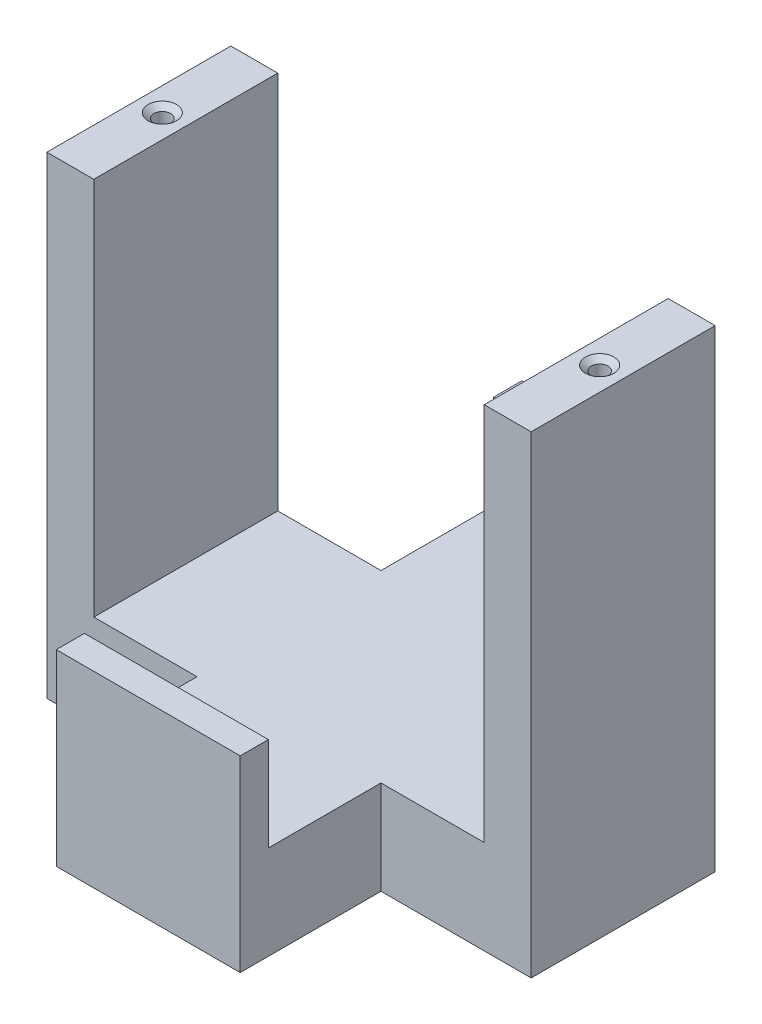
ISO-10303-21;
HEADER;
FILE_DESCRIPTION(('STEP AP214'),'2;1');
FILE_NAME('part.step','',(''),(''),'','','');
FILE_SCHEMA(('AUTOMOTIVE_DESIGN { 1 0 10303 214 1 1 1 1 }'));
ENDSEC;
DATA;
#1=APPLICATION_CONTEXT('core data for automotive mechanical design processes');
#2=APPLICATION_PROTOCOL_DEFINITION('international standard','automotive_design',2000,#1);
#3=PRODUCT_CONTEXT('',#1,'mechanical');
#4=PRODUCT('Part','Part','',(#3));
#5=PRODUCT_RELATED_PRODUCT_CATEGORY('part','',(#4));
#6=PRODUCT_DEFINITION_FORMATION('','',#4);
#7=PRODUCT_DEFINITION_CONTEXT('part definition',#1,'design');
#8=PRODUCT_DEFINITION('design','',#6,#7);
#9=PRODUCT_DEFINITION_SHAPE('','',#8);
#10=(LENGTH_UNIT() NAMED_UNIT(*) SI_UNIT(.MILLI.,.METRE.));
#11=(NAMED_UNIT(*) PLANE_ANGLE_UNIT() SI_UNIT($,.RADIAN.));
#12=(NAMED_UNIT(*) SI_UNIT($,.STERADIAN.) SOLID_ANGLE_UNIT());
#13=UNCERTAINTY_MEASURE_WITH_UNIT(LENGTH_MEASURE(1.E-05),#10,'distance_accuracy_value','');
#14=(GEOMETRIC_REPRESENTATION_CONTEXT(3) GLOBAL_UNCERTAINTY_ASSIGNED_CONTEXT((#13)) GLOBAL_UNIT_ASSIGNED_CONTEXT((#10,
#11,#12)) REPRESENTATION_CONTEXT('',''));
#15=CARTESIAN_POINT('',(0.,0.,0.));
#16=DIRECTION('',(0.,0.,1.));
#17=DIRECTION('',(1.,0.,0.));
#18=AXIS2_PLACEMENT_3D('',#15,#16,#17);
#19=CARTESIAN_POINT('',(0.,50.4,0.));
#20=DIRECTION('',(0.,-1.,0.));
#21=DIRECTION('',(0.,0.,-1.));
#22=AXIS2_PLACEMENT_3D('',#19,#20,#21);
#23=PLANE('',#22);
#24=DIRECTION('',(-1.,0.,0.));
#25=VECTOR('',#24,1.);
#26=CARTESIAN_POINT('',(20.8,50.4,-9.8));
#27=LINE('',#26,#25);
#28=CARTESIAN_POINT('',(25.8,50.4,-9.80000000000001));
#29=VERTEX_POINT('',#28);
#30=CARTESIAN_POINT('',(20.8,50.4,-9.8));
#31=VERTEX_POINT('',#30);
#32=EDGE_CURVE('E201',#29,#31,#27,.T.);
#33=ORIENTED_EDGE('',*,*,#32,.T.);
#34=DIRECTION('',(0.,0.,1.));
#35=VECTOR('',#34,1.);
#36=CARTESIAN_POINT('',(20.8,50.4,-9.8));
#37=LINE('',#36,#35);
#38=CARTESIAN_POINT('',(20.8,50.4,9.8));
#39=VERTEX_POINT('',#38);
#40=EDGE_CURVE('E220',#31,#39,#37,.T.);
#41=ORIENTED_EDGE('',*,*,#40,.T.);
#42=DIRECTION('',(1.,0.,0.));
#43=VECTOR('',#42,1.);
#44=CARTESIAN_POINT('',(20.8,50.4,9.8));
#45=LINE('',#44,#43);
#46=CARTESIAN_POINT('',(25.8,50.4,9.8));
#47=VERTEX_POINT('',#46);
#48=EDGE_CURVE('E223',#39,#47,#45,.T.);
#49=ORIENTED_EDGE('',*,*,#48,.T.);
#50=DIRECTION('',(0.,0.,-1.));
#51=VECTOR('',#50,1.);
#52=CARTESIAN_POINT('',(25.8,50.4,-9.80000000000001));
#53=LINE('',#52,#51);
#54=EDGE_CURVE('E226',#47,#29,#53,.T.);
#55=ORIENTED_EDGE('',*,*,#54,.T.);
#56=EDGE_LOOP('',(#33,#41,#49,#55));
#57=FACE_BOUND('',#56,.T.);
#58=CARTESIAN_POINT('',(23.3,50.4,0.));
#59=DIRECTION('',(0.,1.,0.));
#60=DIRECTION('',(0.,0.,1.));
#61=AXIS2_PLACEMENT_3D('',#58,#59,#60);
#62=CIRCLE('',#61,1.5113);
#63=CARTESIAN_POINT('',(23.3,50.4,1.51130000000001));
#64=VERTEX_POINT('',#63);
#65=EDGE_CURVE('E521',#64,#64,#62,.T.);
#66=ORIENTED_EDGE('',*,*,#65,.F.);
#67=EDGE_LOOP('',(#66));
#68=FACE_BOUND('',#67,.T.);
#69=ADVANCED_FACE('F39',(#57,#68),#23,.F.);
#70=CARTESIAN_POINT('',(9.8,10.,-9.8));
#71=DIRECTION('',(0.,0.,1.));
#72=DIRECTION('',(1.,0.,0.));
#73=AXIS2_PLACEMENT_3D('',#70,#71,#72);
#74=PLANE('',#73);
#75=DIRECTION('',(-1.,0.,0.));
#76=VECTOR('',#75,1.);
#77=CARTESIAN_POINT('',(9.8,0.,-9.8));
#78=LINE('',#77,#76);
#79=CARTESIAN_POINT('',(25.8,0.,-9.80000000000001));
#80=VERTEX_POINT('',#79);
#81=CARTESIAN_POINT('',(9.8,0.,-9.8));
#82=VERTEX_POINT('',#81);
#83=EDGE_CURVE('E145',#80,#82,#78,.T.);
#84=ORIENTED_EDGE('',*,*,#83,.T.);
#85=DIRECTION('',(0.,-1.,0.));
#86=VECTOR('',#85,1.);
#87=CARTESIAN_POINT('',(9.8,10.,-9.8));
#88=LINE('',#87,#86);
#89=CARTESIAN_POINT('',(9.8,10.,-9.8));
#90=VERTEX_POINT('',#89);
#91=EDGE_CURVE('E11',#90,#82,#88,.T.);
#92=ORIENTED_EDGE('',*,*,#91,.F.);
#93=DIRECTION('',(-1.,0.,0.));
#94=VECTOR('',#93,1.);
#95=CARTESIAN_POINT('',(9.8,10.,-9.8));
#96=LINE('',#95,#94);
#97=CARTESIAN_POINT('',(20.8,10.,-9.8));
#98=VERTEX_POINT('',#97);
#99=EDGE_CURVE('E164',#98,#90,#96,.T.);
#100=ORIENTED_EDGE('',*,*,#99,.F.);
#101=DIRECTION('',(0.,-1.,0.));
#102=VECTOR('',#101,1.);
#103=CARTESIAN_POINT('',(20.8,50.4,-9.8));
#104=LINE('',#103,#102);
#105=EDGE_CURVE('E56',#31,#98,#104,.T.);
#106=ORIENTED_EDGE('',*,*,#105,.F.);
#107=ORIENTED_EDGE('',*,*,#32,.F.);
#108=DIRECTION('',(0.,-1.,0.));
#109=VECTOR('',#108,1.);
#110=CARTESIAN_POINT('',(25.8,50.4,-9.80000000000001));
#111=LINE('',#110,#109);
#112=EDGE_CURVE('E228',#29,#80,#111,.T.);
#113=ORIENTED_EDGE('',*,*,#112,.T.);
#114=EDGE_LOOP('',(#84,#92,#100,#106,#107,#113));
#115=FACE_BOUND('',#114,.T.);
#116=ADVANCED_FACE('F41',(#115),#74,.F.);
#117=CARTESIAN_POINT('',(9.8,10.,-21.8));
#118=DIRECTION('',(-1.,0.,0.));
#119=DIRECTION('',(0.,0.,1.));
#120=AXIS2_PLACEMENT_3D('',#117,#118,#119);
#121=PLANE('',#120);
#122=DIRECTION('',(0.,0.,-1.));
#123=VECTOR('',#122,1.);
#124=CARTESIAN_POINT('',(9.8,0.,-21.8));
#125=LINE('',#124,#123);
#126=CARTESIAN_POINT('',(9.8,0.,-24.8));
#127=VERTEX_POINT('',#126);
#128=EDGE_CURVE('E148',#82,#127,#125,.T.);
#129=ORIENTED_EDGE('',*,*,#128,.T.);
#130=DIRECTION('',(0.,1.,0.));
#131=VECTOR('',#130,1.);
#132=CARTESIAN_POINT('',(9.8,0.,-24.8));
#133=LINE('',#132,#131);
#134=CARTESIAN_POINT('',(9.8,20.,-24.8));
#135=VERTEX_POINT('',#134);
#136=EDGE_CURVE('E305',#127,#135,#133,.T.);
#137=ORIENTED_EDGE('',*,*,#136,.T.);
#138=DIRECTION('',(0.,0.,-1.));
#139=VECTOR('',#138,1.);
#140=CARTESIAN_POINT('',(9.8,20.,-24.8));
#141=LINE('',#140,#139);
#142=CARTESIAN_POINT('',(9.8,20.,-21.8));
#143=VERTEX_POINT('',#142);
#144=EDGE_CURVE('E285',#143,#135,#141,.T.);
#145=ORIENTED_EDGE('',*,*,#144,.F.);
#146=DIRECTION('',(0.,1.,0.));
#147=VECTOR('',#146,1.);
#148=CARTESIAN_POINT('',(9.8,0.,-21.8));
#149=LINE('',#148,#147);
#150=CARTESIAN_POINT('',(9.8,10.,-21.8));
#151=VERTEX_POINT('',#150);
#152=EDGE_CURVE('E297',#151,#143,#149,.T.);
#153=ORIENTED_EDGE('',*,*,#152,.F.);
#154=DIRECTION('',(0.,0.,-1.));
#155=VECTOR('',#154,1.);
#156=CARTESIAN_POINT('',(9.8,10.,-21.8));
#157=LINE('',#156,#155);
#158=EDGE_CURVE('E91',#90,#151,#157,.T.);
#159=ORIENTED_EDGE('',*,*,#158,.F.);
#160=ORIENTED_EDGE('',*,*,#91,.T.);
#161=EDGE_LOOP('',(#129,#137,#145,#153,#159,#160));
#162=FACE_BOUND('',#161,.T.);
#163=ADVANCED_FACE('F390',(#162),#121,.F.);
#164=CARTESIAN_POINT('',(-9.8,10.,-21.8));
#165=DIRECTION('',(1.,0.,0.));
#166=DIRECTION('',(0.,0.,-1.));
#167=AXIS2_PLACEMENT_3D('',#164,#165,#166);
#168=PLANE('',#167);
#169=DIRECTION('',(0.,0.,1.));
#170=VECTOR('',#169,1.);
#171=CARTESIAN_POINT('',(-9.8,0.,-21.8));
#172=LINE('',#171,#170);
#173=CARTESIAN_POINT('',(-9.8,0.,-24.8));
#174=VERTEX_POINT('',#173);
#175=CARTESIAN_POINT('',(-9.8,0.,-9.8));
#176=VERTEX_POINT('',#175);
#177=EDGE_CURVE('E151',#174,#176,#172,.T.);
#178=ORIENTED_EDGE('',*,*,#177,.T.);
#179=DIRECTION('',(0.,-1.,0.));
#180=VECTOR('',#179,1.);
#181=CARTESIAN_POINT('',(-9.8,10.,-9.8));
#182=LINE('',#181,#180);
#183=CARTESIAN_POINT('',(-9.8,10.,-9.8));
#184=VERTEX_POINT('',#183);
#185=EDGE_CURVE('E48',#184,#176,#182,.T.);
#186=ORIENTED_EDGE('',*,*,#185,.F.);
#187=DIRECTION('',(0.,0.,1.));
#188=VECTOR('',#187,1.);
#189=CARTESIAN_POINT('',(-9.8,10.,-21.8));
#190=LINE('',#189,#188);
#191=CARTESIAN_POINT('',(-9.8,10.,-21.8));
#192=VERTEX_POINT('',#191);
#193=EDGE_CURVE('E244',#192,#184,#190,.T.);
#194=ORIENTED_EDGE('',*,*,#193,.F.);
#195=DIRECTION('',(0.,1.,0.));
#196=VECTOR('',#195,1.);
#197=CARTESIAN_POINT('',(-9.8,0.,-21.8));
#198=LINE('',#197,#196);
#199=CARTESIAN_POINT('',(-9.8,20.,-21.8));
#200=VERTEX_POINT('',#199);
#201=EDGE_CURVE('E298',#192,#200,#198,.T.);
#202=ORIENTED_EDGE('',*,*,#201,.T.);
#203=DIRECTION('',(0.,0.,1.));
#204=VECTOR('',#203,1.);
#205=CARTESIAN_POINT('',(-9.8,20.,-21.8));
#206=LINE('',#205,#204);
#207=CARTESIAN_POINT('',(-9.8,20.,-24.8));
#208=VERTEX_POINT('',#207);
#209=EDGE_CURVE('E291',#208,#200,#206,.T.);
#210=ORIENTED_EDGE('',*,*,#209,.F.);
#211=DIRECTION('',(0.,1.,0.));
#212=VECTOR('',#211,1.);
#213=CARTESIAN_POINT('',(-9.8,0.,-24.8));
#214=LINE('',#213,#212);
#215=EDGE_CURVE('E302',#174,#208,#214,.T.);
#216=ORIENTED_EDGE('',*,*,#215,.F.);
#217=EDGE_LOOP('',(#178,#186,#194,#202,#210,#216));
#218=FACE_BOUND('',#217,.T.);
#219=ADVANCED_FACE('F399',(#218),#168,.F.);
#220=CARTESIAN_POINT('',(-9.8,10.,-9.8));
#221=DIRECTION('',(0.,0.,1.));
#222=DIRECTION('',(1.,0.,0.));
#223=AXIS2_PLACEMENT_3D('',#220,#221,#222);
#224=PLANE('',#223);
#225=DIRECTION('',(-1.,0.,0.));
#226=VECTOR('',#225,1.);
#227=CARTESIAN_POINT('',(-9.8,0.,-9.8));
#228=LINE('',#227,#226);
#229=CARTESIAN_POINT('',(-25.8,0.,-9.8));
#230=VERTEX_POINT('',#229);
#231=EDGE_CURVE('E153',#176,#230,#228,.T.);
#232=ORIENTED_EDGE('',*,*,#231,.T.);
#233=DIRECTION('',(0.,-1.,0.));
#234=VECTOR('',#233,1.);
#235=CARTESIAN_POINT('',(-25.8,50.4,-9.8));
#236=LINE('',#235,#234);
#237=CARTESIAN_POINT('',(-25.8,50.4,-9.8));
#238=VERTEX_POINT('',#237);
#239=EDGE_CURVE('E311',#238,#230,#236,.T.);
#240=ORIENTED_EDGE('',*,*,#239,.F.);
#241=DIRECTION('',(-1.,0.,0.));
#242=VECTOR('',#241,1.);
#243=CARTESIAN_POINT('',(-20.8,50.4,-9.8));
#244=LINE('',#243,#242);
#245=CARTESIAN_POINT('',(-20.8,50.4,-9.8));
#246=VERTEX_POINT('',#245);
#247=EDGE_CURVE('E204',#246,#238,#244,.T.);
#248=ORIENTED_EDGE('',*,*,#247,.F.);
#249=DIRECTION('',(0.,-1.,0.));
#250=VECTOR('',#249,1.);
#251=CARTESIAN_POINT('',(-20.8,50.4,-9.8));
#252=LINE('',#251,#250);
#253=CARTESIAN_POINT('',(-20.8,10.,-9.8));
#254=VERTEX_POINT('',#253);
#255=EDGE_CURVE('E301',#246,#254,#252,.T.);
#256=ORIENTED_EDGE('',*,*,#255,.T.);
#257=DIRECTION('',(-1.,0.,0.));
#258=VECTOR('',#257,1.);
#259=CARTESIAN_POINT('',(-9.8,10.,-9.8));
#260=LINE('',#259,#258);
#261=EDGE_CURVE('E178',#184,#254,#260,.T.);
#262=ORIENTED_EDGE('',*,*,#261,.F.);
#263=ORIENTED_EDGE('',*,*,#185,.T.);
#264=EDGE_LOOP('',(#232,#240,#248,#256,#262,#263));
#265=FACE_BOUND('',#264,.T.);
#266=ADVANCED_FACE('F172',(#265),#224,.F.);
#267=CARTESIAN_POINT('',(-9.8,10.,9.8));
#268=DIRECTION('',(0.,0.,-1.));
#269=DIRECTION('',(-1.,0.,0.));
#270=AXIS2_PLACEMENT_3D('',#267,#268,#269);
#271=PLANE('',#270);
#272=DIRECTION('',(1.,0.,0.));
#273=VECTOR('',#272,1.);
#274=CARTESIAN_POINT('',(-9.8,0.,9.8));
#275=LINE('',#274,#273);
#276=CARTESIAN_POINT('',(-25.8,0.,9.80000000000001));
#277=VERTEX_POINT('',#276);
#278=CARTESIAN_POINT('',(-9.8,0.,9.8));
#279=VERTEX_POINT('',#278);
#280=EDGE_CURVE('E75',#277,#279,#275,.T.);
#281=ORIENTED_EDGE('',*,*,#280,.T.);
#282=DIRECTION('',(0.,-1.,0.));
#283=VECTOR('',#282,1.);
#284=CARTESIAN_POINT('',(-9.8,10.,9.8));
#285=LINE('',#284,#283);
#286=CARTESIAN_POINT('',(-9.8,10.,9.8));
#287=VERTEX_POINT('',#286);
#288=EDGE_CURVE('E166',#287,#279,#285,.T.);
#289=ORIENTED_EDGE('',*,*,#288,.F.);
#290=DIRECTION('',(1.,0.,0.));
#291=VECTOR('',#290,1.);
#292=CARTESIAN_POINT('',(-9.8,10.,9.8));
#293=LINE('',#292,#291);
#294=CARTESIAN_POINT('',(-20.8,10.,9.8));
#295=VERTEX_POINT('',#294);
#296=EDGE_CURVE('E250',#295,#287,#293,.T.);
#297=ORIENTED_EDGE('',*,*,#296,.F.);
#298=DIRECTION('',(0.,-1.,0.));
#299=VECTOR('',#298,1.);
#300=CARTESIAN_POINT('',(-20.8,50.4,9.80000000000001));
#301=LINE('',#300,#299);
#302=CARTESIAN_POINT('',(-20.8,50.4,9.80000000000001));
#303=VERTEX_POINT('',#302);
#304=EDGE_CURVE('E208',#303,#295,#301,.T.);
#305=ORIENTED_EDGE('',*,*,#304,.F.);
#306=DIRECTION('',(1.,0.,0.));
#307=VECTOR('',#306,1.);
#308=CARTESIAN_POINT('',(-20.8,50.4,9.80000000000001));
#309=LINE('',#308,#307);
#310=CARTESIAN_POINT('',(-25.8,50.4,9.80000000000001));
#311=VERTEX_POINT('',#310);
#312=EDGE_CURVE('E210',#311,#303,#309,.T.);
#313=ORIENTED_EDGE('',*,*,#312,.F.);
#314=DIRECTION('',(0.,-1.,0.));
#315=VECTOR('',#314,1.);
#316=CARTESIAN_POINT('',(-25.8,50.4,9.80000000000001));
#317=LINE('',#316,#315);
#318=EDGE_CURVE('E312',#311,#277,#317,.T.);
#319=ORIENTED_EDGE('',*,*,#318,.T.);
#320=EDGE_LOOP('',(#281,#289,#297,#305,#313,#319));
#321=FACE_BOUND('',#320,.T.);
#322=ADVANCED_FACE('F254',(#321),#271,.F.);
#323=CARTESIAN_POINT('',(-9.8,10.,21.8));
#324=DIRECTION('',(1.,0.,0.));
#325=DIRECTION('',(0.,0.,-1.));
#326=AXIS2_PLACEMENT_3D('',#323,#324,#325);
#327=PLANE('',#326);
#328=DIRECTION('',(0.,0.,1.));
#329=VECTOR('',#328,1.);
#330=CARTESIAN_POINT('',(-9.8,0.,21.8));
#331=LINE('',#330,#329);
#332=CARTESIAN_POINT('',(-9.8,0.,24.8));
#333=VERTEX_POINT('',#332);
#334=EDGE_CURVE('E157',#279,#333,#331,.T.);
#335=ORIENTED_EDGE('',*,*,#334,.T.);
#336=DIRECTION('',(0.,1.,0.));
#337=VECTOR('',#336,1.);
#338=CARTESIAN_POINT('',(-9.8,0.,24.8));
#339=LINE('',#338,#337);
#340=CARTESIAN_POINT('',(-9.8,20.,24.8));
#341=VERTEX_POINT('',#340);
#342=EDGE_CURVE('E264',#333,#341,#339,.T.);
#343=ORIENTED_EDGE('',*,*,#342,.T.);
#344=DIRECTION('',(0.,0.,1.));
#345=VECTOR('',#344,1.);
#346=CARTESIAN_POINT('',(-9.8,20.,21.8));
#347=LINE('',#346,#345);
#348=CARTESIAN_POINT('',(-9.8,20.,21.8));
#349=VERTEX_POINT('',#348);
#350=EDGE_CURVE('E261',#349,#341,#347,.T.);
#351=ORIENTED_EDGE('',*,*,#350,.F.);
#352=DIRECTION('',(0.,1.,0.));
#353=VECTOR('',#352,1.);
#354=CARTESIAN_POINT('',(-9.8,0.,21.8));
#355=LINE('',#354,#353);
#356=CARTESIAN_POINT('',(-9.8,10.,21.8));
#357=VERTEX_POINT('',#356);
#358=EDGE_CURVE('E125',#357,#349,#355,.T.);
#359=ORIENTED_EDGE('',*,*,#358,.F.);
#360=DIRECTION('',(0.,0.,1.));
#361=VECTOR('',#360,1.);
#362=CARTESIAN_POINT('',(-9.8,10.,21.8));
#363=LINE('',#362,#361);
#364=EDGE_CURVE('E133',#287,#357,#363,.T.);
#365=ORIENTED_EDGE('',*,*,#364,.F.);
#366=ORIENTED_EDGE('',*,*,#288,.T.);
#367=EDGE_LOOP('',(#335,#343,#351,#359,#365,#366));
#368=FACE_BOUND('',#367,.T.);
#369=ADVANCED_FACE('F256',(#368),#327,.F.);
#370=CARTESIAN_POINT('',(9.80000000000001,10.,21.8));
#371=DIRECTION('',(-1.,0.,0.));
#372=DIRECTION('',(0.,0.,1.));
#373=AXIS2_PLACEMENT_3D('',#370,#371,#372);
#374=PLANE('',#373);
#375=DIRECTION('',(0.,0.,-1.));
#376=VECTOR('',#375,1.);
#377=CARTESIAN_POINT('',(9.80000000000001,0.,21.8));
#378=LINE('',#377,#376);
#379=CARTESIAN_POINT('',(9.80000000000001,0.,24.8));
#380=VERTEX_POINT('',#379);
#381=CARTESIAN_POINT('',(9.8,0.,9.8));
#382=VERTEX_POINT('',#381);
#383=EDGE_CURVE('E83',#380,#382,#378,.T.);
#384=ORIENTED_EDGE('',*,*,#383,.T.);
#385=DIRECTION('',(0.,-1.,0.));
#386=VECTOR('',#385,1.);
#387=CARTESIAN_POINT('',(9.8,10.,9.8));
#388=LINE('',#387,#386);
#389=CARTESIAN_POINT('',(9.8,10.,9.8));
#390=VERTEX_POINT('',#389);
#391=EDGE_CURVE('E136',#390,#382,#388,.T.);
#392=ORIENTED_EDGE('',*,*,#391,.F.);
#393=DIRECTION('',(0.,0.,-1.));
#394=VECTOR('',#393,1.);
#395=CARTESIAN_POINT('',(9.80000000000001,10.,21.8));
#396=LINE('',#395,#394);
#397=CARTESIAN_POINT('',(9.80000000000001,10.,21.8));
#398=VERTEX_POINT('',#397);
#399=EDGE_CURVE('E131',#398,#390,#396,.T.);
#400=ORIENTED_EDGE('',*,*,#399,.F.);
#401=DIRECTION('',(0.,1.,0.));
#402=VECTOR('',#401,1.);
#403=CARTESIAN_POINT('',(9.80000000000001,0.,21.8));
#404=LINE('',#403,#402);
#405=CARTESIAN_POINT('',(9.80000000000001,20.,21.8));
#406=VERTEX_POINT('',#405);
#407=EDGE_CURVE('E111',#398,#406,#404,.T.);
#408=ORIENTED_EDGE('',*,*,#407,.T.);
#409=DIRECTION('',(0.,0.,-1.));
#410=VECTOR('',#409,1.);
#411=CARTESIAN_POINT('',(9.80000000000001,20.,24.8));
#412=LINE('',#411,#410);
#413=CARTESIAN_POINT('',(9.80000000000001,20.,24.8));
#414=VERTEX_POINT('',#413);
#415=EDGE_CURVE('E280',#414,#406,#412,.T.);
#416=ORIENTED_EDGE('',*,*,#415,.F.);
#417=DIRECTION('',(0.,1.,0.));
#418=VECTOR('',#417,1.);
#419=CARTESIAN_POINT('',(9.80000000000001,0.,24.8));
#420=LINE('',#419,#418);
#421=EDGE_CURVE('E266',#380,#414,#420,.T.);
#422=ORIENTED_EDGE('',*,*,#421,.F.);
#423=EDGE_LOOP('',(#384,#392,#400,#408,#416,#422));
#424=FACE_BOUND('',#423,.T.);
#425=ADVANCED_FACE('F135',(#424),#374,.F.);
#426=CARTESIAN_POINT('',(9.8,10.,9.8));
#427=DIRECTION('',(0.,0.,-1.));
#428=DIRECTION('',(-1.,0.,0.));
#429=AXIS2_PLACEMENT_3D('',#426,#427,#428);
#430=PLANE('',#429);
#431=DIRECTION('',(1.,0.,0.));
#432=VECTOR('',#431,1.);
#433=CARTESIAN_POINT('',(9.8,0.,9.8));
#434=LINE('',#433,#432);
#435=CARTESIAN_POINT('',(25.8,0.,9.8));
#436=VERTEX_POINT('',#435);
#437=EDGE_CURVE('E161',#382,#436,#434,.T.);
#438=ORIENTED_EDGE('',*,*,#437,.T.);
#439=DIRECTION('',(0.,-1.,0.));
#440=VECTOR('',#439,1.);
#441=CARTESIAN_POINT('',(25.8,50.4,9.8));
#442=LINE('',#441,#440);
#443=EDGE_CURVE('E232',#47,#436,#442,.T.);
#444=ORIENTED_EDGE('',*,*,#443,.F.);
#445=ORIENTED_EDGE('',*,*,#48,.F.);
#446=DIRECTION('',(0.,-1.,0.));
#447=VECTOR('',#446,1.);
#448=CARTESIAN_POINT('',(20.8,50.4,9.8));
#449=LINE('',#448,#447);
#450=CARTESIAN_POINT('',(20.8,10.,9.8));
#451=VERTEX_POINT('',#450);
#452=EDGE_CURVE('E235',#39,#451,#449,.T.);
#453=ORIENTED_EDGE('',*,*,#452,.T.);
#454=DIRECTION('',(1.,0.,0.));
#455=VECTOR('',#454,1.);
#456=CARTESIAN_POINT('',(9.8,10.,9.8));
#457=LINE('',#456,#455);
#458=EDGE_CURVE('E138',#390,#451,#457,.T.);
#459=ORIENTED_EDGE('',*,*,#458,.F.);
#460=ORIENTED_EDGE('',*,*,#391,.T.);
#461=EDGE_LOOP('',(#438,#444,#445,#453,#459,#460));
#462=FACE_BOUND('',#461,.T.);
#463=ADVANCED_FACE('F360',(#462),#430,.F.);
#464=CARTESIAN_POINT('',(0.,10.,0.));
#465=DIRECTION('',(0.,-1.,0.));
#466=DIRECTION('',(0.,0.,-1.));
#467=AXIS2_PLACEMENT_3D('',#464,#465,#466);
#468=PLANE('',#467);
#469=ORIENTED_EDGE('',*,*,#99,.T.);
#470=ORIENTED_EDGE('',*,*,#158,.T.);
#471=DIRECTION('',(-1.,0.,0.));
#472=VECTOR('',#471,1.);
#473=CARTESIAN_POINT('',(-9.8,10.,-21.8));
#474=LINE('',#473,#472);
#475=EDGE_CURVE('E241',#151,#192,#474,.T.);
#476=ORIENTED_EDGE('',*,*,#475,.T.);
#477=ORIENTED_EDGE('',*,*,#193,.T.);
#478=ORIENTED_EDGE('',*,*,#261,.T.);
#479=DIRECTION('',(0.,0.,1.));
#480=VECTOR('',#479,1.);
#481=CARTESIAN_POINT('',(-20.8,10.,-9.8));
#482=LINE('',#481,#480);
#483=EDGE_CURVE('E247',#254,#295,#482,.T.);
#484=ORIENTED_EDGE('',*,*,#483,.T.);
#485=ORIENTED_EDGE('',*,*,#296,.T.);
#486=ORIENTED_EDGE('',*,*,#364,.T.);
#487=DIRECTION('',(1.,0.,0.));
#488=VECTOR('',#487,1.);
#489=CARTESIAN_POINT('',(-9.8,10.,21.8));
#490=LINE('',#489,#488);
#491=EDGE_CURVE('E116',#357,#398,#490,.T.);
#492=ORIENTED_EDGE('',*,*,#491,.T.);
#493=ORIENTED_EDGE('',*,*,#399,.T.);
#494=ORIENTED_EDGE('',*,*,#458,.T.);
#495=DIRECTION('',(0.,0.,-1.));
#496=VECTOR('',#495,1.);
#497=CARTESIAN_POINT('',(20.8,10.,-9.8));
#498=LINE('',#497,#496);
#499=EDGE_CURVE('E140',#451,#98,#498,.T.);
#500=ORIENTED_EDGE('',*,*,#499,.T.);
#501=EDGE_LOOP('',(#469,#470,#476,#477,#478,#484,#485,#486,#492,#493,#494,#500));
#502=FACE_BOUND('',#501,.T.);
#503=ADVANCED_FACE('F129',(#502),#468,.F.);
#504=CARTESIAN_POINT('',(0.,0.,0.));
#505=DIRECTION('',(0.,-1.,0.));
#506=DIRECTION('',(0.,0.,-1.));
#507=AXIS2_PLACEMENT_3D('',#504,#505,#506);
#508=PLANE('',#507);
#509=CARTESIAN_POINT('',(17.8,0.,0.));
#510=DIRECTION('',(0.,-1.,0.));
#511=DIRECTION('',(0.,0.,-1.));
#512=AXIS2_PLACEMENT_3D('',#509,#510,#511);
#513=CIRCLE('',#512,1.5113);
#514=CARTESIAN_POINT('',(17.8,0.,-1.5113));
#515=VERTEX_POINT('',#514);
#516=EDGE_CURVE('E496',#515,#515,#513,.T.);
#517=ORIENTED_EDGE('',*,*,#516,.F.);
#518=EDGE_LOOP('',(#517));
#519=FACE_BOUND('',#518,.T.);
#520=CARTESIAN_POINT('',(-17.8,0.,0.));
#521=DIRECTION('',(0.,-1.,0.));
#522=DIRECTION('',(0.,0.,-1.));
#523=AXIS2_PLACEMENT_3D('',#520,#521,#522);
#524=CIRCLE('',#523,1.5113);
#525=CARTESIAN_POINT('',(-17.8,0.,-1.5113));
#526=VERTEX_POINT('',#525);
#527=EDGE_CURVE('E503',#526,#526,#524,.T.);
#528=ORIENTED_EDGE('',*,*,#527,.F.);
#529=EDGE_LOOP('',(#528));
#530=FACE_BOUND('',#529,.T.);
#531=ORIENTED_EDGE('',*,*,#83,.F.);
#532=DIRECTION('',(0.,0.,-1.));
#533=VECTOR('',#532,1.);
#534=CARTESIAN_POINT('',(25.8,0.,-9.80000000000001));
#535=LINE('',#534,#533);
#536=EDGE_CURVE('E197',#436,#80,#535,.T.);
#537=ORIENTED_EDGE('',*,*,#536,.F.);
#538=ORIENTED_EDGE('',*,*,#437,.F.);
#539=ORIENTED_EDGE('',*,*,#383,.F.);
#540=DIRECTION('',(1.,0.,0.));
#541=VECTOR('',#540,1.);
#542=CARTESIAN_POINT('',(-9.8,0.,24.8));
#543=LINE('',#542,#541);
#544=EDGE_CURVE('E124',#333,#380,#543,.T.);
#545=ORIENTED_EDGE('',*,*,#544,.F.);
#546=ORIENTED_EDGE('',*,*,#334,.F.);
#547=ORIENTED_EDGE('',*,*,#280,.F.);
#548=DIRECTION('',(0.,0.,1.));
#549=VECTOR('',#548,1.);
#550=CARTESIAN_POINT('',(-25.8,0.,-9.8));
#551=LINE('',#550,#549);
#552=EDGE_CURVE('E190',#230,#277,#551,.T.);
#553=ORIENTED_EDGE('',*,*,#552,.F.);
#554=ORIENTED_EDGE('',*,*,#231,.F.);
#555=ORIENTED_EDGE('',*,*,#177,.F.);
#556=DIRECTION('',(-1.,0.,0.));
#557=VECTOR('',#556,1.);
#558=CARTESIAN_POINT('',(-9.8,0.,-24.8));
#559=LINE('',#558,#557);
#560=EDGE_CURVE('E294',#127,#174,#559,.T.);
#561=ORIENTED_EDGE('',*,*,#560,.F.);
#562=ORIENTED_EDGE('',*,*,#128,.F.);
#563=EDGE_LOOP('',(#531,#537,#538,#539,#545,#546,#547,#553,#554,#555,#561,#562));
#564=FACE_BOUND('',#563,.T.);
#565=ADVANCED_FACE('F185',(#519,#530,#564),#508,.T.);
#566=CARTESIAN_POINT('',(20.8,50.4,-9.8));
#567=DIRECTION('',(1.,0.,0.));
#568=DIRECTION('',(0.,0.,-1.));
#569=AXIS2_PLACEMENT_3D('',#566,#567,#568);
#570=PLANE('',#569);
#571=ORIENTED_EDGE('',*,*,#499,.F.);
#572=ORIENTED_EDGE('',*,*,#452,.F.);
#573=ORIENTED_EDGE('',*,*,#40,.F.);
#574=ORIENTED_EDGE('',*,*,#105,.T.);
#575=EDGE_LOOP('',(#571,#572,#573,#574));
#576=FACE_BOUND('',#575,.T.);
#577=ADVANCED_FACE('F402',(#576),#570,.F.);
#578=CARTESIAN_POINT('',(25.8,50.4,-9.80000000000001));
#579=DIRECTION('',(-1.,0.,0.));
#580=DIRECTION('',(0.,0.,1.));
#581=AXIS2_PLACEMENT_3D('',#578,#579,#580);
#582=PLANE('',#581);
#583=ORIENTED_EDGE('',*,*,#536,.T.);
#584=ORIENTED_EDGE('',*,*,#112,.F.);
#585=ORIENTED_EDGE('',*,*,#54,.F.);
#586=ORIENTED_EDGE('',*,*,#443,.T.);
#587=EDGE_LOOP('',(#583,#584,#585,#586));
#588=FACE_BOUND('',#587,.T.);
#589=ADVANCED_FACE('F350',(#588),#582,.F.);
#590=CARTESIAN_POINT('',(-20.8,50.4,-9.8));
#591=DIRECTION('',(-1.,0.,0.));
#592=DIRECTION('',(0.,0.,1.));
#593=AXIS2_PLACEMENT_3D('',#590,#591,#592);
#594=PLANE('',#593);
#595=ORIENTED_EDGE('',*,*,#483,.F.);
#596=ORIENTED_EDGE('',*,*,#255,.F.);
#597=DIRECTION('',(0.,0.,-1.));
#598=VECTOR('',#597,1.);
#599=CARTESIAN_POINT('',(-20.8,50.4,-9.8));
#600=LINE('',#599,#598);
#601=EDGE_CURVE('E198',#303,#246,#600,.T.);
#602=ORIENTED_EDGE('',*,*,#601,.F.);
#603=ORIENTED_EDGE('',*,*,#304,.T.);
#604=EDGE_LOOP('',(#595,#596,#602,#603));
#605=FACE_BOUND('',#604,.T.);
#606=ADVANCED_FACE('F316',(#605),#594,.F.);
#607=CARTESIAN_POINT('',(-25.8,50.4,-9.8));
#608=DIRECTION('',(1.,0.,0.));
#609=DIRECTION('',(0.,0.,-1.));
#610=AXIS2_PLACEMENT_3D('',#607,#608,#609);
#611=PLANE('',#610);
#612=ORIENTED_EDGE('',*,*,#552,.T.);
#613=ORIENTED_EDGE('',*,*,#318,.F.);
#614=DIRECTION('',(0.,0.,1.));
#615=VECTOR('',#614,1.);
#616=CARTESIAN_POINT('',(-25.8,50.4,-9.8));
#617=LINE('',#616,#615);
#618=EDGE_CURVE('E213',#238,#311,#617,.T.);
#619=ORIENTED_EDGE('',*,*,#618,.F.);
#620=ORIENTED_EDGE('',*,*,#239,.T.);
#621=EDGE_LOOP('',(#612,#613,#619,#620));
#622=FACE_BOUND('',#621,.T.);
#623=ADVANCED_FACE('F424',(#622),#611,.F.);
#624=CARTESIAN_POINT('',(0.,50.4,0.));
#625=DIRECTION('',(0.,-1.,0.));
#626=DIRECTION('',(0.,0.,-1.));
#627=AXIS2_PLACEMENT_3D('',#624,#625,#626);
#628=PLANE('',#627);
#629=CARTESIAN_POINT('',(-23.3,50.4,0.));
#630=DIRECTION('',(0.,1.,0.));
#631=DIRECTION('',(0.,0.,1.));
#632=AXIS2_PLACEMENT_3D('',#629,#630,#631);
#633=CIRCLE('',#632,1.5113);
#634=CARTESIAN_POINT('',(-23.3,50.4,1.5113));
#635=VERTEX_POINT('',#634);
#636=EDGE_CURVE('E512',#635,#635,#633,.T.);
#637=ORIENTED_EDGE('',*,*,#636,.F.);
#638=EDGE_LOOP('',(#637));
#639=FACE_BOUND('',#638,.T.);
#640=ORIENTED_EDGE('',*,*,#601,.T.);
#641=ORIENTED_EDGE('',*,*,#247,.T.);
#642=ORIENTED_EDGE('',*,*,#618,.T.);
#643=ORIENTED_EDGE('',*,*,#312,.T.);
#644=EDGE_LOOP('',(#640,#641,#642,#643));
#645=FACE_BOUND('',#644,.T.);
#646=ADVANCED_FACE('F422',(#639,#645),#628,.F.);
#647=CARTESIAN_POINT('',(9.8,0.,-21.8));
#648=DIRECTION('',(0.,0.,1.));
#649=DIRECTION('',(1.,0.,0.));
#650=AXIS2_PLACEMENT_3D('',#647,#648,#649);
#651=PLANE('',#650);
#652=ORIENTED_EDGE('',*,*,#475,.F.);
#653=ORIENTED_EDGE('',*,*,#152,.T.);
#654=DIRECTION('',(1.,0.,0.));
#655=VECTOR('',#654,1.);
#656=CARTESIAN_POINT('',(9.8,20.,-21.8));
#657=LINE('',#656,#655);
#658=EDGE_CURVE('E282',#200,#143,#657,.T.);
#659=ORIENTED_EDGE('',*,*,#658,.F.);
#660=ORIENTED_EDGE('',*,*,#201,.F.);
#661=EDGE_LOOP('',(#652,#653,#659,#660));
#662=FACE_BOUND('',#661,.T.);
#663=ADVANCED_FACE('F401',(#662),#651,.T.);
#664=CARTESIAN_POINT('',(-9.8,0.,-24.8));
#665=DIRECTION('',(0.,0.,-1.));
#666=DIRECTION('',(-1.,0.,0.));
#667=AXIS2_PLACEMENT_3D('',#664,#665,#666);
#668=PLANE('',#667);
#669=ORIENTED_EDGE('',*,*,#215,.T.);
#670=DIRECTION('',(-1.,0.,0.));
#671=VECTOR('',#670,1.);
#672=CARTESIAN_POINT('',(-9.8,20.,-24.8));
#673=LINE('',#672,#671);
#674=EDGE_CURVE('E288',#135,#208,#673,.T.);
#675=ORIENTED_EDGE('',*,*,#674,.F.);
#676=ORIENTED_EDGE('',*,*,#136,.F.);
#677=ORIENTED_EDGE('',*,*,#560,.T.);
#678=EDGE_LOOP('',(#669,#675,#676,#677));
#679=FACE_BOUND('',#678,.T.);
#680=ADVANCED_FACE('F394',(#679),#668,.T.);
#681=CARTESIAN_POINT('',(0.,20.,0.));
#682=DIRECTION('',(0.,-1.,0.));
#683=DIRECTION('',(0.,0.,-1.));
#684=AXIS2_PLACEMENT_3D('',#681,#682,#683);
#685=PLANE('',#684);
#686=ORIENTED_EDGE('',*,*,#658,.T.);
#687=ORIENTED_EDGE('',*,*,#144,.T.);
#688=ORIENTED_EDGE('',*,*,#674,.T.);
#689=ORIENTED_EDGE('',*,*,#209,.T.);
#690=EDGE_LOOP('',(#686,#687,#688,#689));
#691=FACE_BOUND('',#690,.T.);
#692=ADVANCED_FACE('F397',(#691),#685,.F.);
#693=CARTESIAN_POINT('',(9.80000000000001,0.,21.8));
#694=DIRECTION('',(0.,0.,-1.));
#695=DIRECTION('',(-1.,0.,0.));
#696=AXIS2_PLACEMENT_3D('',#693,#694,#695);
#697=PLANE('',#696);
#698=ORIENTED_EDGE('',*,*,#491,.F.);
#699=ORIENTED_EDGE('',*,*,#358,.T.);
#700=DIRECTION('',(-1.,0.,0.));
#701=VECTOR('',#700,1.);
#702=CARTESIAN_POINT('',(9.80000000000001,20.,21.8));
#703=LINE('',#702,#701);
#704=EDGE_CURVE('E120',#406,#349,#703,.T.);
#705=ORIENTED_EDGE('',*,*,#704,.F.);
#706=ORIENTED_EDGE('',*,*,#407,.F.);
#707=EDGE_LOOP('',(#698,#699,#705,#706));
#708=FACE_BOUND('',#707,.T.);
#709=ADVANCED_FACE('F113',(#708),#697,.T.);
#710=CARTESIAN_POINT('',(-9.8,0.,24.8));
#711=DIRECTION('',(0.,0.,1.));
#712=DIRECTION('',(1.,0.,0.));
#713=AXIS2_PLACEMENT_3D('',#710,#711,#712);
#714=PLANE('',#713);
#715=ORIENTED_EDGE('',*,*,#421,.T.);
#716=DIRECTION('',(1.,0.,0.));
#717=VECTOR('',#716,1.);
#718=CARTESIAN_POINT('',(-9.8,20.,24.8));
#719=LINE('',#718,#717);
#720=EDGE_CURVE('E275',#341,#414,#719,.T.);
#721=ORIENTED_EDGE('',*,*,#720,.F.);
#722=ORIENTED_EDGE('',*,*,#342,.F.);
#723=ORIENTED_EDGE('',*,*,#544,.T.);
#724=EDGE_LOOP('',(#715,#721,#722,#723));
#725=FACE_BOUND('',#724,.T.);
#726=ADVANCED_FACE('F370',(#725),#714,.T.);
#727=CARTESIAN_POINT('',(0.,20.,0.));
#728=DIRECTION('',(0.,1.,0.));
#729=DIRECTION('',(0.,0.,1.));
#730=AXIS2_PLACEMENT_3D('',#727,#728,#729);
#731=PLANE('',#730);
#732=ORIENTED_EDGE('',*,*,#415,.T.);
#733=ORIENTED_EDGE('',*,*,#704,.T.);
#734=ORIENTED_EDGE('',*,*,#350,.T.);
#735=ORIENTED_EDGE('',*,*,#720,.T.);
#736=EDGE_LOOP('',(#732,#733,#734,#735));
#737=FACE_BOUND('',#736,.T.);
#738=ADVANCED_FACE('F375',(#737),#731,.T.);
#739=CARTESIAN_POINT('',(23.3,45.4,0.));
#740=DIRECTION('',(0.,1.,0.));
#741=DIRECTION('',(0.,0.,1.));
#742=AXIS2_PLACEMENT_3D('',#739,#740,#741);
#743=CONICAL_SURFACE('',#742,0.888999999999997,1.02974425867665);
#744=CARTESIAN_POINT('',(23.3,44.8658349096845,0.));
#745=VERTEX_POINT('',#744);
#746=VERTEX_LOOP('',#745);
#747=FACE_BOUND('',#746,.T.);
#748=CARTESIAN_POINT('',(23.3,45.4,0.));
#749=DIRECTION('',(0.,1.,0.));
#750=DIRECTION('',(0.,0.,1.));
#751=AXIS2_PLACEMENT_3D('',#748,#749,#750);
#752=CIRCLE('',#751,0.888999999999997);
#753=CARTESIAN_POINT('',(23.3,45.4,0.889000000000012));
#754=VERTEX_POINT('',#753);
#755=EDGE_CURVE('E272',#754,#754,#752,.T.);
#756=ORIENTED_EDGE('',*,*,#755,.T.);
#757=EDGE_LOOP('',(#756));
#758=FACE_BOUND('',#757,.T.);
#759=ADVANCED_FACE('F437',(#747,#758),#743,.F.);
#760=CARTESIAN_POINT('',(23.3,50.4,0.));
#761=DIRECTION('',(0.,1.,0.));
#762=DIRECTION('',(0.,0.,1.));
#763=AXIS2_PLACEMENT_3D('',#760,#761,#762);
#764=CYLINDRICAL_SURFACE('',#763,0.888999999999999);
#765=ORIENTED_EDGE('',*,*,#755,.F.);
#766=EDGE_LOOP('',(#765));
#767=FACE_BOUND('',#766,.T.);
#768=CARTESIAN_POINT('',(23.3,49.8778282995184,0.));
#769=DIRECTION('',(0.,1.,0.));
#770=DIRECTION('',(0.,0.,1.));
#771=AXIS2_PLACEMENT_3D('',#768,#769,#770);
#772=CIRCLE('',#771,0.889000000000001);
#773=CARTESIAN_POINT('',(23.3,49.8778282995184,0.889000000000015));
#774=VERTEX_POINT('',#773);
#775=EDGE_CURVE('E524',#774,#774,#772,.T.);
#776=ORIENTED_EDGE('',*,*,#775,.T.);
#777=EDGE_LOOP('',(#776));
#778=FACE_BOUND('',#777,.T.);
#779=ADVANCED_FACE('F444',(#767,#778),#764,.F.);
#780=CARTESIAN_POINT('',(23.3,50.4,0.));
#781=DIRECTION('',(0.,1.,0.));
#782=DIRECTION('',(0.,0.,1.));
#783=AXIS2_PLACEMENT_3D('',#780,#781,#782);
#784=CONICAL_SURFACE('',#783,1.5113,0.872664625997166);
#785=ORIENTED_EDGE('',*,*,#775,.F.);
#786=EDGE_LOOP('',(#785));
#787=FACE_BOUND('',#786,.T.);
#788=ORIENTED_EDGE('',*,*,#65,.T.);
#789=EDGE_LOOP('',(#788));
#790=FACE_BOUND('',#789,.T.);
#791=ADVANCED_FACE('F448',(#787,#790),#784,.F.);
#792=CARTESIAN_POINT('',(-23.3,45.4,0.));
#793=DIRECTION('',(0.,1.,0.));
#794=DIRECTION('',(0.,0.,1.));
#795=AXIS2_PLACEMENT_3D('',#792,#793,#794);
#796=CONICAL_SURFACE('',#795,0.888999999999997,1.02974425867665);
#797=CARTESIAN_POINT('',(-23.3,44.8658349096845,0.));
#798=VERTEX_POINT('',#797);
#799=VERTEX_LOOP('',#798);
#800=FACE_BOUND('',#799,.T.);
#801=CARTESIAN_POINT('',(-23.3,45.4,0.));
#802=DIRECTION('',(0.,1.,0.));
#803=DIRECTION('',(0.,0.,1.));
#804=AXIS2_PLACEMENT_3D('',#801,#802,#803);
#805=CIRCLE('',#804,0.888999999999997);
#806=CARTESIAN_POINT('',(-23.3,45.4,0.888999999999998));
#807=VERTEX_POINT('',#806);
#808=EDGE_CURVE('E518',#807,#807,#805,.T.);
#809=ORIENTED_EDGE('',*,*,#808,.T.);
#810=EDGE_LOOP('',(#809));
#811=FACE_BOUND('',#810,.T.);
#812=ADVANCED_FACE('F452',(#800,#811),#796,.F.);
#813=CARTESIAN_POINT('',(-23.3,50.4,0.));
#814=DIRECTION('',(0.,1.,0.));
#815=DIRECTION('',(0.,0.,1.));
#816=AXIS2_PLACEMENT_3D('',#813,#814,#815);
#817=CYLINDRICAL_SURFACE('',#816,0.888999999999999);
#818=ORIENTED_EDGE('',*,*,#808,.F.);
#819=EDGE_LOOP('',(#818));
#820=FACE_BOUND('',#819,.T.);
#821=CARTESIAN_POINT('',(-23.3,49.8778282995184,0.));
#822=DIRECTION('',(0.,1.,0.));
#823=DIRECTION('',(0.,0.,1.));
#824=AXIS2_PLACEMENT_3D('',#821,#822,#823);
#825=CIRCLE('',#824,0.889000000000001);
#826=CARTESIAN_POINT('',(-23.3,49.8778282995184,0.889000000000001));
#827=VERTEX_POINT('',#826);
#828=EDGE_CURVE('E515',#827,#827,#825,.T.);
#829=ORIENTED_EDGE('',*,*,#828,.T.);
#830=EDGE_LOOP('',(#829));
#831=FACE_BOUND('',#830,.T.);
#832=ADVANCED_FACE('F456',(#820,#831),#817,.F.);
#833=CARTESIAN_POINT('',(-23.3,50.4,0.));
#834=DIRECTION('',(0.,1.,0.));
#835=DIRECTION('',(0.,0.,1.));
#836=AXIS2_PLACEMENT_3D('',#833,#834,#835);
#837=CONICAL_SURFACE('',#836,1.5113,0.872664625997166);
#838=ORIENTED_EDGE('',*,*,#828,.F.);
#839=EDGE_LOOP('',(#838));
#840=FACE_BOUND('',#839,.T.);
#841=ORIENTED_EDGE('',*,*,#636,.T.);
#842=EDGE_LOOP('',(#841));
#843=FACE_BOUND('',#842,.T.);
#844=ADVANCED_FACE('F460',(#840,#843),#837,.F.);
#845=CARTESIAN_POINT('',(-17.8,5.,0.));
#846=DIRECTION('',(0.,-1.,0.));
#847=DIRECTION('',(0.,0.,-1.));
#848=AXIS2_PLACEMENT_3D('',#845,#846,#847);
#849=CONICAL_SURFACE('',#848,0.888999999999987,1.02974425867665);
#850=CARTESIAN_POINT('',(-17.8,5.5341650903155,0.));
#851=VERTEX_POINT('',#850);
#852=VERTEX_LOOP('',#851);
#853=FACE_BOUND('',#852,.T.);
#854=CARTESIAN_POINT('',(-17.8,5.,0.));
#855=DIRECTION('',(0.,-1.,0.));
#856=DIRECTION('',(0.,0.,-1.));
#857=AXIS2_PLACEMENT_3D('',#854,#855,#856);
#858=CIRCLE('',#857,0.888999999999987);
#859=CARTESIAN_POINT('',(-17.8,5.,-0.888999999999984));
#860=VERTEX_POINT('',#859);
#861=EDGE_CURVE('E509',#860,#860,#858,.T.);
#862=ORIENTED_EDGE('',*,*,#861,.T.);
#863=EDGE_LOOP('',(#862));
#864=FACE_BOUND('',#863,.T.);
#865=ADVANCED_FACE('F464',(#853,#864),#849,.F.);
#866=CARTESIAN_POINT('',(-17.8,0.,0.));
#867=DIRECTION('',(0.,-1.,0.));
#868=DIRECTION('',(0.,0.,-1.));
#869=AXIS2_PLACEMENT_3D('',#866,#867,#868);
#870=CYLINDRICAL_SURFACE('',#869,0.888999999999987);
#871=ORIENTED_EDGE('',*,*,#861,.F.);
#872=EDGE_LOOP('',(#871));
#873=FACE_BOUND('',#872,.T.);
#874=CARTESIAN_POINT('',(-17.8,0.522171700481619,0.));
#875=DIRECTION('',(0.,-1.,0.));
#876=DIRECTION('',(0.,0.,-1.));
#877=AXIS2_PLACEMENT_3D('',#874,#875,#876);
#878=CIRCLE('',#877,0.888999999999987);
#879=CARTESIAN_POINT('',(-17.8,0.522171700481619,-0.888999999999984));
#880=VERTEX_POINT('',#879);
#881=EDGE_CURVE('E506',#880,#880,#878,.T.);
#882=ORIENTED_EDGE('',*,*,#881,.T.);
#883=EDGE_LOOP('',(#882));
#884=FACE_BOUND('',#883,.T.);
#885=ADVANCED_FACE('F468',(#873,#884),#870,.F.);
#886=CARTESIAN_POINT('',(-17.8,0.,0.));
#887=DIRECTION('',(0.,-1.,0.));
#888=DIRECTION('',(0.,0.,-1.));
#889=AXIS2_PLACEMENT_3D('',#886,#887,#888);
#890=CONICAL_SURFACE('',#889,1.5113,0.872664625997176);
#891=ORIENTED_EDGE('',*,*,#881,.F.);
#892=EDGE_LOOP('',(#891));
#893=FACE_BOUND('',#892,.T.);
#894=ORIENTED_EDGE('',*,*,#527,.T.);
#895=EDGE_LOOP('',(#894));
#896=FACE_BOUND('',#895,.T.);
#897=ADVANCED_FACE('F472',(#893,#896),#890,.F.);
#898=CARTESIAN_POINT('',(17.8,5.,0.));
#899=DIRECTION('',(0.,-1.,0.));
#900=DIRECTION('',(0.,0.,-1.));
#901=AXIS2_PLACEMENT_3D('',#898,#899,#900);
#902=CONICAL_SURFACE('',#901,0.888999999999987,1.02974425867665);
#903=CARTESIAN_POINT('',(17.8,5.5341650903155,0.));
#904=VERTEX_POINT('',#903);
#905=VERTEX_LOOP('',#904);
#906=FACE_BOUND('',#905,.T.);
#907=CARTESIAN_POINT('',(17.8,5.,0.));
#908=DIRECTION('',(0.,-1.,0.));
#909=DIRECTION('',(0.,0.,-1.));
#910=AXIS2_PLACEMENT_3D('',#907,#908,#909);
#911=CIRCLE('',#910,0.888999999999987);
#912=CARTESIAN_POINT('',(17.8,5.,-0.888999999999987));
#913=VERTEX_POINT('',#912);
#914=EDGE_CURVE('E498',#913,#913,#911,.T.);
#915=ORIENTED_EDGE('',*,*,#914,.T.);
#916=EDGE_LOOP('',(#915));
#917=FACE_BOUND('',#916,.T.);
#918=ADVANCED_FACE('F476',(#906,#917),#902,.F.);
#919=CARTESIAN_POINT('',(17.8,0.,0.));
#920=DIRECTION('',(0.,-1.,0.));
#921=DIRECTION('',(0.,0.,-1.));
#922=AXIS2_PLACEMENT_3D('',#919,#920,#921);
#923=CYLINDRICAL_SURFACE('',#922,0.888999999999987);
#924=ORIENTED_EDGE('',*,*,#914,.F.);
#925=EDGE_LOOP('',(#924));
#926=FACE_BOUND('',#925,.T.);
#927=CARTESIAN_POINT('',(17.8,0.522171700481619,0.));
#928=DIRECTION('',(0.,-1.,0.));
#929=DIRECTION('',(0.,0.,-1.));
#930=AXIS2_PLACEMENT_3D('',#927,#928,#929);
#931=CIRCLE('',#930,0.888999999999987);
#932=CARTESIAN_POINT('',(17.8,0.522171700481619,-0.888999999999987));
#933=VERTEX_POINT('',#932);
#934=EDGE_CURVE('E493',#933,#933,#931,.T.);
#935=ORIENTED_EDGE('',*,*,#934,.T.);
#936=EDGE_LOOP('',(#935));
#937=FACE_BOUND('',#936,.T.);
#938=ADVANCED_FACE('F480',(#926,#937),#923,.F.);
#939=CARTESIAN_POINT('',(17.8,0.,0.));
#940=DIRECTION('',(0.,-1.,0.));
#941=DIRECTION('',(0.,0.,-1.));
#942=AXIS2_PLACEMENT_3D('',#939,#940,#941);
#943=CONICAL_SURFACE('',#942,1.5113,0.872664625997176);
#944=ORIENTED_EDGE('',*,*,#934,.F.);
#945=EDGE_LOOP('',(#944));
#946=FACE_BOUND('',#945,.T.);
#947=ORIENTED_EDGE('',*,*,#516,.T.);
#948=EDGE_LOOP('',(#947));
#949=FACE_BOUND('',#948,.T.);
#950=ADVANCED_FACE('F484',(#946,#949),#943,.F.);
#951=CLOSED_SHELL('',(#69,#116,#163,#219,#266,#322,#369,#425,#463,#503,#565,#577,#589,#606,#623,
#646,#663,#680,#692,#709,#726,#738,#759,#779,#791,#812,#832,#844,#865,#885,#897,#918,#938,#950));
#952=MANIFOLD_SOLID_BREP('B2',#951);
#953=ADVANCED_BREP_SHAPE_REPRESENTATION('',(#18,#952),#14);
#954=SHAPE_DEFINITION_REPRESENTATION(#9,#953);
ENDSEC;
END-ISO-10303-21;
